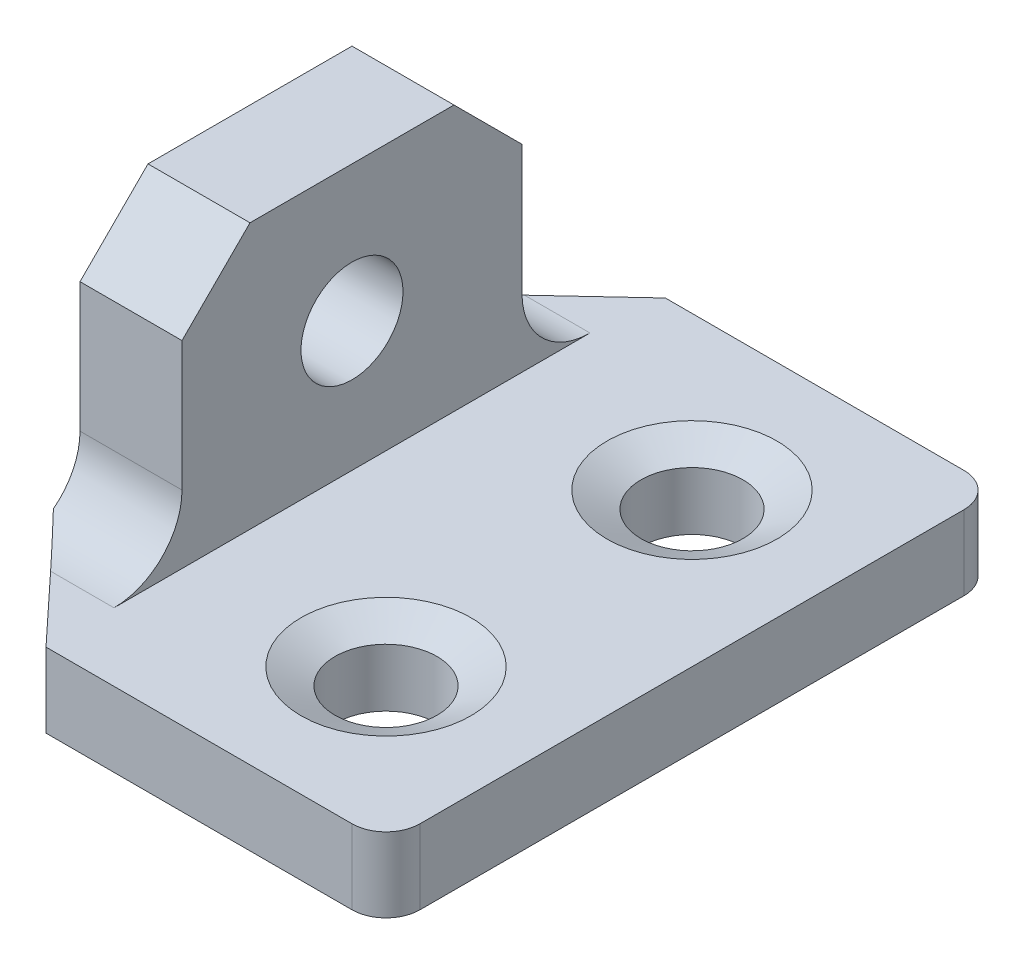
ISO-10303-21;
HEADER;
FILE_DESCRIPTION(('STEP AP214'),'2;1');
FILE_NAME('part.step','',(''),(''),'','','');
FILE_SCHEMA(('AUTOMOTIVE_DESIGN { 1 0 10303 214 1 1 1 1 }'));
ENDSEC;
DATA;
#1=APPLICATION_CONTEXT('core data for automotive mechanical design processes');
#2=APPLICATION_PROTOCOL_DEFINITION('international standard','automotive_design',2000,#1);
#3=PRODUCT_CONTEXT('',#1,'mechanical');
#4=PRODUCT('Part','Part','',(#3));
#5=PRODUCT_RELATED_PRODUCT_CATEGORY('part','',(#4));
#6=PRODUCT_DEFINITION_FORMATION('','',#4);
#7=PRODUCT_DEFINITION_CONTEXT('part definition',#1,'design');
#8=PRODUCT_DEFINITION('design','',#6,#7);
#9=PRODUCT_DEFINITION_SHAPE('','',#8);
#10=(LENGTH_UNIT() NAMED_UNIT(*) SI_UNIT(.MILLI.,.METRE.));
#11=(NAMED_UNIT(*) PLANE_ANGLE_UNIT() SI_UNIT($,.RADIAN.));
#12=(NAMED_UNIT(*) SI_UNIT($,.STERADIAN.) SOLID_ANGLE_UNIT());
#13=UNCERTAINTY_MEASURE_WITH_UNIT(LENGTH_MEASURE(1.E-05),#10,'distance_accuracy_value','');
#14=(GEOMETRIC_REPRESENTATION_CONTEXT(3) GLOBAL_UNCERTAINTY_ASSIGNED_CONTEXT((#13)) GLOBAL_UNIT_ASSIGNED_CONTEXT((#10,
#11,#12)) REPRESENTATION_CONTEXT('',''));
#15=CARTESIAN_POINT('',(0.,0.,0.));
#16=DIRECTION('',(0.,0.,1.));
#17=DIRECTION('',(1.,0.,0.));
#18=AXIS2_PLACEMENT_3D('',#15,#16,#17);
#19=CARTESIAN_POINT('',(28.,15.,20.));
#20=DIRECTION('',(0.,0.,1.));
#21=DIRECTION('',(1.,0.,0.));
#22=AXIS2_PLACEMENT_3D('',#19,#20,#21);
#23=PLANE('',#22);
#24=DIRECTION('',(0.,-1.,0.));
#25=VECTOR('',#24,1.);
#26=CARTESIAN_POINT('',(28.,15.,20.));
#27=LINE('',#26,#25);
#28=CARTESIAN_POINT('',(28.,13.,20.));
#29=VERTEX_POINT('',#28);
#30=CARTESIAN_POINT('',(28.,9.19234606418695,20.));
#31=VERTEX_POINT('',#30);
#32=EDGE_CURVE('E195',#29,#31,#27,.T.);
#33=ORIENTED_EDGE('',*,*,#32,.T.);
#34=DIRECTION('',(-1.,0.,0.));
#35=VECTOR('',#34,1.);
#36=CARTESIAN_POINT('',(28.,9.19234606418695,20.));
#37=LINE('',#36,#35);
#38=CARTESIAN_POINT('',(25.,9.19234606418695,20.));
#39=VERTEX_POINT('',#38);
#40=EDGE_CURVE('E248',#31,#39,#37,.T.);
#41=ORIENTED_EDGE('',*,*,#40,.T.);
#42=DIRECTION('',(0.,-1.,0.));
#43=VECTOR('',#42,1.);
#44=CARTESIAN_POINT('',(25.,15.,20.));
#45=LINE('',#44,#43);
#46=CARTESIAN_POINT('',(25.,13.,20.));
#47=VERTEX_POINT('',#46);
#48=EDGE_CURVE('E198',#47,#39,#45,.T.);
#49=ORIENTED_EDGE('',*,*,#48,.F.);
#50=DIRECTION('',(1.,0.,0.));
#51=VECTOR('',#50,1.);
#52=CARTESIAN_POINT('',(28.,13.,20.));
#53=LINE('',#52,#51);
#54=EDGE_CURVE('E193',#47,#29,#53,.T.);
#55=ORIENTED_EDGE('',*,*,#54,.T.);
#56=EDGE_LOOP('',(#33,#41,#49,#55));
#57=FACE_BOUND('',#56,.T.);
#58=ADVANCED_FACE('F43',(#57),#23,.F.);
#59=CARTESIAN_POINT('',(25.,15.,20.));
#60=DIRECTION('',(1.,0.,0.));
#61=DIRECTION('',(0.,0.,-1.));
#62=AXIS2_PLACEMENT_3D('',#59,#60,#61);
#63=PLANE('',#62);
#64=CARTESIAN_POINT('',(25.,11.,25.));
#65=DIRECTION('',(1.,0.,0.));
#66=DIRECTION('',(0.,0.,-1.));
#67=AXIS2_PLACEMENT_3D('',#64,#65,#66);
#68=CIRCLE('',#67,1.5);
#69=CARTESIAN_POINT('',(25.,11.,23.5));
#70=VERTEX_POINT('',#69);
#71=EDGE_CURVE('E199',#70,#70,#68,.T.);
#72=ORIENTED_EDGE('',*,*,#71,.T.);
#73=EDGE_LOOP('',(#72));
#74=FACE_BOUND('',#73,.T.);
#75=DIRECTION('',(0.,0.,1.));
#76=VECTOR('',#75,1.);
#77=CARTESIAN_POINT('',(25.,5.,20.));
#78=LINE('',#77,#76);
#79=CARTESIAN_POINT('',(25.,5.,19.));
#80=VERTEX_POINT('',#79);
#81=CARTESIAN_POINT('',(25.,5.,30.782893869926));
#82=VERTEX_POINT('',#81);
#83=EDGE_CURVE('E186',#80,#82,#78,.T.);
#84=ORIENTED_EDGE('',*,*,#83,.T.);
#85=DIRECTION('',(0.,1.,0.));
#86=VECTOR('',#85,1.);
#87=CARTESIAN_POINT('',(25.,7.19234606418695,30.782893869926));
#88=LINE('',#87,#86);
#89=CARTESIAN_POINT('',(25.,7.60531970393395,30.782893869926));
#90=VERTEX_POINT('',#89);
#91=EDGE_CURVE('E232',#82,#90,#88,.T.);
#92=ORIENTED_EDGE('',*,*,#91,.T.);
#93=CARTESIAN_POINT('',(25.,9.19234606418695,32.));
#94=DIRECTION('',(1.,0.,0.));
#95=DIRECTION('',(0.,0.,-1.));
#96=AXIS2_PLACEMENT_3D('',#93,#94,#95);
#97=CIRCLE('',#96,2.);
#98=CARTESIAN_POINT('',(25.,9.19234606418695,30.));
#99=VERTEX_POINT('',#98);
#100=EDGE_CURVE('E256',#90,#99,#97,.T.);
#101=ORIENTED_EDGE('',*,*,#100,.T.);
#102=DIRECTION('',(0.,-1.,0.));
#103=VECTOR('',#102,1.);
#104=CARTESIAN_POINT('',(25.,15.,30.));
#105=LINE('',#104,#103);
#106=CARTESIAN_POINT('',(25.,13.,30.));
#107=VERTEX_POINT('',#106);
#108=EDGE_CURVE('E183',#107,#99,#105,.T.);
#109=ORIENTED_EDGE('',*,*,#108,.F.);
#110=DIRECTION('',(0.,0.707106781186548,-0.707106781186548));
#111=VECTOR('',#110,1.);
#112=CARTESIAN_POINT('',(25.,15.,28.));
#113=LINE('',#112,#111);
#114=CARTESIAN_POINT('',(25.,15.,28.));
#115=VERTEX_POINT('',#114);
#116=EDGE_CURVE('E182',#107,#115,#113,.T.);
#117=ORIENTED_EDGE('',*,*,#116,.T.);
#118=DIRECTION('',(0.,0.,1.));
#119=VECTOR('',#118,1.);
#120=CARTESIAN_POINT('',(25.,15.,20.));
#121=LINE('',#120,#119);
#122=CARTESIAN_POINT('',(25.,15.,22.));
#123=VERTEX_POINT('',#122);
#124=EDGE_CURVE('E204',#123,#115,#121,.T.);
#125=ORIENTED_EDGE('',*,*,#124,.F.);
#126=DIRECTION('',(0.,-0.70710678118655,-0.707106781186545));
#127=VECTOR('',#126,1.);
#128=CARTESIAN_POINT('',(25.,15.,22.));
#129=LINE('',#128,#127);
#130=EDGE_CURVE('E197',#123,#47,#129,.T.);
#131=ORIENTED_EDGE('',*,*,#130,.T.);
#132=ORIENTED_EDGE('',*,*,#48,.T.);
#133=CARTESIAN_POINT('',(25.,9.19234606418695,18.));
#134=DIRECTION('',(1.,0.,0.));
#135=DIRECTION('',(0.,0.,-1.));
#136=AXIS2_PLACEMENT_3D('',#133,#134,#135);
#137=CIRCLE('',#136,2.);
#138=CARTESIAN_POINT('',(25.,7.46029525661808,19.));
#139=VERTEX_POINT('',#138);
#140=EDGE_CURVE('E258',#39,#139,#137,.T.);
#141=ORIENTED_EDGE('',*,*,#140,.T.);
#142=DIRECTION('',(0.,-1.,0.));
#143=VECTOR('',#142,1.);
#144=CARTESIAN_POINT('',(25.,4.99999999999999,19.));
#145=LINE('',#144,#143);
#146=EDGE_CURVE('E230',#139,#80,#145,.T.);
#147=ORIENTED_EDGE('',*,*,#146,.T.);
#148=EDGE_LOOP('',(#84,#92,#101,#109,#117,#125,#131,#132,#141,#147));
#149=FACE_BOUND('',#148,.T.);
#150=ADVANCED_FACE('F342',(#74,#149),#63,.F.);
#151=CARTESIAN_POINT('',(25.,15.,30.));
#152=DIRECTION('',(0.,0.,-1.));
#153=DIRECTION('',(-1.,0.,0.));
#154=AXIS2_PLACEMENT_3D('',#151,#152,#153);
#155=PLANE('',#154);
#156=ORIENTED_EDGE('',*,*,#108,.T.);
#157=DIRECTION('',(1.,0.,0.));
#158=VECTOR('',#157,1.);
#159=CARTESIAN_POINT('',(25.,9.19234606418695,30.));
#160=LINE('',#159,#158);
#161=CARTESIAN_POINT('',(28.,9.19234606418695,30.));
#162=VERTEX_POINT('',#161);
#163=EDGE_CURVE('E178',#99,#162,#160,.T.);
#164=ORIENTED_EDGE('',*,*,#163,.T.);
#165=DIRECTION('',(0.,-1.,0.));
#166=VECTOR('',#165,1.);
#167=CARTESIAN_POINT('',(28.,15.,30.));
#168=LINE('',#167,#166);
#169=CARTESIAN_POINT('',(28.,13.,30.));
#170=VERTEX_POINT('',#169);
#171=EDGE_CURVE('E162',#170,#162,#168,.T.);
#172=ORIENTED_EDGE('',*,*,#171,.F.);
#173=DIRECTION('',(-1.,0.,0.));
#174=VECTOR('',#173,1.);
#175=CARTESIAN_POINT('',(25.,13.,30.));
#176=LINE('',#175,#174);
#177=EDGE_CURVE('E175',#170,#107,#176,.T.);
#178=ORIENTED_EDGE('',*,*,#177,.T.);
#179=EDGE_LOOP('',(#156,#164,#172,#178));
#180=FACE_BOUND('',#179,.T.);
#181=ADVANCED_FACE('F174',(#180),#155,.F.);
#182=CARTESIAN_POINT('',(28.,15.,30.));
#183=DIRECTION('',(-1.,0.,0.));
#184=DIRECTION('',(0.,0.,1.));
#185=AXIS2_PLACEMENT_3D('',#182,#183,#184);
#186=PLANE('',#185);
#187=CARTESIAN_POINT('',(28.,11.,25.));
#188=DIRECTION('',(1.,0.,0.));
#189=DIRECTION('',(0.,0.,-1.));
#190=AXIS2_PLACEMENT_3D('',#187,#188,#189);
#191=CIRCLE('',#190,1.5);
#192=CARTESIAN_POINT('',(28.,11.,23.5));
#193=VERTEX_POINT('',#192);
#194=EDGE_CURVE('E207',#193,#193,#191,.T.);
#195=ORIENTED_EDGE('',*,*,#194,.F.);
#196=EDGE_LOOP('',(#195));
#197=FACE_BOUND('',#196,.T.);
#198=ORIENTED_EDGE('',*,*,#171,.T.);
#199=CARTESIAN_POINT('',(28.,9.19234606418695,32.));
#200=DIRECTION('',(-1.,0.,0.));
#201=DIRECTION('',(0.,0.,1.));
#202=AXIS2_PLACEMENT_3D('',#199,#200,#201);
#203=CIRCLE('',#202,2.);
#204=CARTESIAN_POINT('',(28.,7.19234606418695,32.));
#205=VERTEX_POINT('',#204);
#206=EDGE_CURVE('E251',#162,#205,#203,.T.);
#207=ORIENTED_EDGE('',*,*,#206,.T.);
#208=DIRECTION('',(0.,0.,-1.));
#209=VECTOR('',#208,1.);
#210=CARTESIAN_POINT('',(28.,7.19234606418695,30.));
#211=LINE('',#210,#209);
#212=CARTESIAN_POINT('',(28.,7.19234606418695,18.));
#213=VERTEX_POINT('',#212);
#214=EDGE_CURVE('E221',#205,#213,#211,.T.);
#215=ORIENTED_EDGE('',*,*,#214,.T.);
#216=CARTESIAN_POINT('',(28.,9.19234606418695,18.));
#217=DIRECTION('',(-1.,0.,0.));
#218=DIRECTION('',(0.,0.,1.));
#219=AXIS2_PLACEMENT_3D('',#216,#217,#218);
#220=CIRCLE('',#219,2.);
#221=EDGE_CURVE('E263',#213,#31,#220,.T.);
#222=ORIENTED_EDGE('',*,*,#221,.T.);
#223=ORIENTED_EDGE('',*,*,#32,.F.);
#224=DIRECTION('',(0.,0.70710678118655,0.707106781186545));
#225=VECTOR('',#224,1.);
#226=CARTESIAN_POINT('',(28.,15.,22.));
#227=LINE('',#226,#225);
#228=CARTESIAN_POINT('',(28.,15.,22.));
#229=VERTEX_POINT('',#228);
#230=EDGE_CURVE('E169',#29,#229,#227,.T.);
#231=ORIENTED_EDGE('',*,*,#230,.T.);
#232=DIRECTION('',(0.,0.,-1.));
#233=VECTOR('',#232,1.);
#234=CARTESIAN_POINT('',(28.,15.,30.));
#235=LINE('',#234,#233);
#236=CARTESIAN_POINT('',(28.,15.,28.));
#237=VERTEX_POINT('',#236);
#238=EDGE_CURVE('E164',#237,#229,#235,.T.);
#239=ORIENTED_EDGE('',*,*,#238,.F.);
#240=DIRECTION('',(0.,-0.707106781186548,0.707106781186548));
#241=VECTOR('',#240,1.);
#242=CARTESIAN_POINT('',(28.,15.,28.));
#243=LINE('',#242,#241);
#244=EDGE_CURVE('E158',#237,#170,#243,.T.);
#245=ORIENTED_EDGE('',*,*,#244,.T.);
#246=EDGE_LOOP('',(#198,#207,#215,#222,#223,#231,#239,#245));
#247=FACE_BOUND('',#246,.T.);
#248=ADVANCED_FACE('F160',(#197,#247),#186,.F.);
#249=CARTESIAN_POINT('',(0.,15.,0.));
#250=DIRECTION('',(0.,1.,0.));
#251=DIRECTION('',(0.,0.,1.));
#252=AXIS2_PLACEMENT_3D('',#249,#250,#251);
#253=PLANE('',#252);
#254=ORIENTED_EDGE('',*,*,#238,.T.);
#255=DIRECTION('',(-1.,0.,0.));
#256=VECTOR('',#255,1.);
#257=CARTESIAN_POINT('',(25.,15.,22.));
#258=LINE('',#257,#256);
#259=EDGE_CURVE('E201',#229,#123,#258,.T.);
#260=ORIENTED_EDGE('',*,*,#259,.T.);
#261=ORIENTED_EDGE('',*,*,#124,.T.);
#262=DIRECTION('',(1.,0.,0.));
#263=VECTOR('',#262,1.);
#264=CARTESIAN_POINT('',(28.,15.,28.));
#265=LINE('',#264,#263);
#266=EDGE_CURVE('E205',#115,#237,#265,.T.);
#267=ORIENTED_EDGE('',*,*,#266,.T.);
#268=EDGE_LOOP('',(#254,#260,#261,#267));
#269=FACE_BOUND('',#268,.T.);
#270=ADVANCED_FACE('F359',(#269),#253,.T.);
#271=CARTESIAN_POINT('',(0.,15.,22.));
#272=DIRECTION('',(0.,0.707106781186545,-0.70710678118655));
#273=DIRECTION('',(1.,0.,0.));
#274=AXIS2_PLACEMENT_3D('',#271,#272,#273);
#275=PLANE('',#274);
#276=ORIENTED_EDGE('',*,*,#230,.F.);
#277=ORIENTED_EDGE('',*,*,#54,.F.);
#278=ORIENTED_EDGE('',*,*,#130,.F.);
#279=ORIENTED_EDGE('',*,*,#259,.F.);
#280=EDGE_LOOP('',(#276,#277,#278,#279));
#281=FACE_BOUND('',#280,.T.);
#282=ADVANCED_FACE('F352',(#281),#275,.T.);
#283=CARTESIAN_POINT('',(0.,15.,28.));
#284=DIRECTION('',(0.,0.707106781186547,0.707106781186547));
#285=DIRECTION('',(-1.,0.,0.));
#286=AXIS2_PLACEMENT_3D('',#283,#284,#285);
#287=PLANE('',#286);
#288=ORIENTED_EDGE('',*,*,#116,.F.);
#289=ORIENTED_EDGE('',*,*,#177,.F.);
#290=ORIENTED_EDGE('',*,*,#244,.F.);
#291=ORIENTED_EDGE('',*,*,#266,.F.);
#292=EDGE_LOOP('',(#288,#289,#290,#291));
#293=FACE_BOUND('',#292,.T.);
#294=ADVANCED_FACE('F181',(#293),#287,.T.);
#295=CARTESIAN_POINT('',(-35.0000000000001,11.,25.0000000000001));
#296=DIRECTION('',(1.,0.,0.));
#297=DIRECTION('',(0.,0.,-1.));
#298=AXIS2_PLACEMENT_3D('',#295,#296,#297);
#299=CYLINDRICAL_SURFACE('',#298,1.5);
#300=ORIENTED_EDGE('',*,*,#194,.T.);
#301=EDGE_LOOP('',(#300));
#302=FACE_BOUND('',#301,.T.);
#303=ORIENTED_EDGE('',*,*,#71,.F.);
#304=EDGE_LOOP('',(#303));
#305=FACE_BOUND('',#304,.T.);
#306=ADVANCED_FACE('F364',(#302,#305),#299,.F.);
#307=CARTESIAN_POINT('',(-71.,5.,75.));
#308=DIRECTION('',(0.,1.,0.));
#309=DIRECTION('',(0.,0.,1.));
#310=AXIS2_PLACEMENT_3D('',#307,#308,#309);
#311=PLANE('',#310);
#312=CARTESIAN_POINT('',(33.5,5.,20.5));
#313=DIRECTION('',(0.,1.,0.));
#314=DIRECTION('',(0.,0.,1.));
#315=AXIS2_PLACEMENT_3D('',#312,#313,#314);
#316=CIRCLE('',#315,1.5);
#317=CARTESIAN_POINT('',(33.5,5.,22.));
#318=VERTEX_POINT('',#317);
#319=EDGE_CURVE('E316',#318,#318,#316,.T.);
#320=ORIENTED_EDGE('',*,*,#319,.T.);
#321=EDGE_LOOP('',(#320));
#322=FACE_BOUND('',#321,.T.);
#323=CARTESIAN_POINT('',(33.5,5.,29.5));
#324=DIRECTION('',(0.,1.,0.));
#325=DIRECTION('',(0.,0.,1.));
#326=AXIS2_PLACEMENT_3D('',#323,#324,#325);
#327=CIRCLE('',#326,1.5);
#328=CARTESIAN_POINT('',(33.5,5.,31.));
#329=VERTEX_POINT('',#328);
#330=EDGE_CURVE('E319',#329,#329,#327,.T.);
#331=ORIENTED_EDGE('',*,*,#330,.T.);
#332=EDGE_LOOP('',(#331));
#333=FACE_BOUND('',#332,.T.);
#334=DIRECTION('',(0.,0.,-1.));
#335=VECTOR('',#334,1.);
#336=CARTESIAN_POINT('',(38.,5.,34.));
#337=LINE('',#336,#335);
#338=CARTESIAN_POINT('',(38.,5.,33.));
#339=VERTEX_POINT('',#338);
#340=CARTESIAN_POINT('',(38.,5.,17.));
#341=VERTEX_POINT('',#340);
#342=EDGE_CURVE('E299',#339,#341,#337,.T.);
#343=ORIENTED_EDGE('',*,*,#342,.F.);
#344=CARTESIAN_POINT('',(37.,5.,33.));
#345=DIRECTION('',(0.,1.,0.));
#346=DIRECTION('',(0.,0.,1.));
#347=AXIS2_PLACEMENT_3D('',#344,#345,#346);
#348=CIRCLE('',#347,1.);
#349=CARTESIAN_POINT('',(37.,5.,34.));
#350=VERTEX_POINT('',#349);
#351=EDGE_CURVE('E285',#339,#350,#348,.F.);
#352=ORIENTED_EDGE('',*,*,#351,.T.);
#353=DIRECTION('',(1.,0.,0.));
#354=VECTOR('',#353,1.);
#355=CARTESIAN_POINT('',(25.,5.,34.));
#356=LINE('',#355,#354);
#357=CARTESIAN_POINT('',(28.,5.,34.));
#358=VERTEX_POINT('',#357);
#359=EDGE_CURVE('E190',#358,#350,#356,.T.);
#360=ORIENTED_EDGE('',*,*,#359,.F.);
#361=DIRECTION('',(-0.6819983600625,0.,-0.731353701619169));
#362=VECTOR('',#361,1.);
#363=CARTESIAN_POINT('',(28.,5.,34.));
#364=LINE('',#363,#362);
#365=EDGE_CURVE('E228',#358,#82,#364,.T.);
#366=ORIENTED_EDGE('',*,*,#365,.T.);
#367=ORIENTED_EDGE('',*,*,#83,.F.);
#368=DIRECTION('',(0.731353701619169,0.,-0.6819983600625));
#369=VECTOR('',#368,1.);
#370=CARTESIAN_POINT('',(28.217106130074,5.,16.));
#371=LINE('',#370,#369);
#372=CARTESIAN_POINT('',(28.217106130074,5.,16.));
#373=VERTEX_POINT('',#372);
#374=EDGE_CURVE('E226',#80,#373,#371,.T.);
#375=ORIENTED_EDGE('',*,*,#374,.T.);
#376=DIRECTION('',(1.,0.,0.));
#377=VECTOR('',#376,1.);
#378=CARTESIAN_POINT('',(25.,5.,16.));
#379=LINE('',#378,#377);
#380=CARTESIAN_POINT('',(37.,5.,16.));
#381=VERTEX_POINT('',#380);
#382=EDGE_CURVE('E307',#373,#381,#379,.T.);
#383=ORIENTED_EDGE('',*,*,#382,.T.);
#384=CARTESIAN_POINT('',(37.,5.,17.));
#385=DIRECTION('',(0.,1.,0.));
#386=DIRECTION('',(0.,0.,1.));
#387=AXIS2_PLACEMENT_3D('',#384,#385,#386);
#388=CIRCLE('',#387,1.);
#389=EDGE_CURVE('E283',#381,#341,#388,.F.);
#390=ORIENTED_EDGE('',*,*,#389,.T.);
#391=EDGE_LOOP('',(#343,#352,#360,#366,#367,#375,#383,#390));
#392=FACE_BOUND('',#391,.T.);
#393=ADVANCED_FACE('F304',(#322,#333,#392),#311,.F.);
#394=CARTESIAN_POINT('',(25.,7.19234606418695,34.));
#395=DIRECTION('',(0.,1.,0.));
#396=DIRECTION('',(0.,0.,1.));
#397=AXIS2_PLACEMENT_3D('',#394,#395,#396);
#398=PLANE('',#397);
#399=CARTESIAN_POINT('',(33.5,7.19234606418695,20.5));
#400=DIRECTION('',(0.,1.,0.));
#401=DIRECTION('',(0.,0.,1.));
#402=AXIS2_PLACEMENT_3D('',#399,#400,#401);
#403=CIRCLE('',#402,2.50000000000002);
#404=CARTESIAN_POINT('',(33.5,7.19234606418695,23.));
#405=VERTEX_POINT('',#404);
#406=EDGE_CURVE('E271',#405,#405,#403,.F.);
#407=ORIENTED_EDGE('',*,*,#406,.T.);
#408=EDGE_LOOP('',(#407));
#409=FACE_BOUND('',#408,.T.);
#410=CARTESIAN_POINT('',(33.5,7.19234606418695,29.5));
#411=DIRECTION('',(0.,1.,0.));
#412=DIRECTION('',(0.,0.,1.));
#413=AXIS2_PLACEMENT_3D('',#410,#411,#412);
#414=CIRCLE('',#413,2.50000000000001);
#415=CARTESIAN_POINT('',(33.5,7.19234606418695,32.));
#416=VERTEX_POINT('',#415);
#417=EDGE_CURVE('E268',#416,#416,#414,.F.);
#418=ORIENTED_EDGE('',*,*,#417,.T.);
#419=EDGE_LOOP('',(#418));
#420=FACE_BOUND('',#419,.T.);
#421=DIRECTION('',(1.,0.,0.));
#422=VECTOR('',#421,1.);
#423=CARTESIAN_POINT('',(25.,7.19234606418695,34.));
#424=LINE('',#423,#422);
#425=CARTESIAN_POINT('',(28.,7.19234606418695,34.));
#426=VERTEX_POINT('',#425);
#427=CARTESIAN_POINT('',(37.,7.19234606418695,34.));
#428=VERTEX_POINT('',#427);
#429=EDGE_CURVE('E196',#426,#428,#424,.T.);
#430=ORIENTED_EDGE('',*,*,#429,.T.);
#431=CARTESIAN_POINT('',(37.,7.19234606418695,33.));
#432=DIRECTION('',(0.,1.,0.));
#433=DIRECTION('',(0.,0.,1.));
#434=AXIS2_PLACEMENT_3D('',#431,#432,#433);
#435=CIRCLE('',#434,1.);
#436=CARTESIAN_POINT('',(38.,7.19234606418695,33.));
#437=VERTEX_POINT('',#436);
#438=EDGE_CURVE('E51',#428,#437,#435,.T.);
#439=ORIENTED_EDGE('',*,*,#438,.T.);
#440=DIRECTION('',(0.,0.,1.));
#441=VECTOR('',#440,1.);
#442=CARTESIAN_POINT('',(38.,7.19234606418695,34.));
#443=LINE('',#442,#441);
#444=CARTESIAN_POINT('',(38.,7.19234606418695,17.));
#445=VERTEX_POINT('',#444);
#446=EDGE_CURVE('E291',#445,#437,#443,.T.);
#447=ORIENTED_EDGE('',*,*,#446,.F.);
#448=CARTESIAN_POINT('',(37.,7.19234606418695,17.));
#449=DIRECTION('',(0.,1.,0.));
#450=DIRECTION('',(0.,0.,1.));
#451=AXIS2_PLACEMENT_3D('',#448,#449,#450);
#452=CIRCLE('',#451,1.);
#453=CARTESIAN_POINT('',(37.,7.19234606418695,16.));
#454=VERTEX_POINT('',#453);
#455=EDGE_CURVE('E58',#445,#454,#452,.T.);
#456=ORIENTED_EDGE('',*,*,#455,.T.);
#457=DIRECTION('',(1.,0.,0.));
#458=VECTOR('',#457,1.);
#459=CARTESIAN_POINT('',(25.,7.19234606418695,16.));
#460=LINE('',#459,#458);
#461=CARTESIAN_POINT('',(28.217106130074,7.19234606418695,16.));
#462=VERTEX_POINT('',#461);
#463=EDGE_CURVE('E309',#462,#454,#460,.T.);
#464=ORIENTED_EDGE('',*,*,#463,.F.);
#465=DIRECTION('',(-0.731353701619169,0.,0.6819983600625));
#466=VECTOR('',#465,1.);
#467=CARTESIAN_POINT('',(17.5182696230513,7.19234606418695,25.9768264469191));
#468=LINE('',#467,#466);
#469=CARTESIAN_POINT('',(26.0723687100247,7.19234606418695,18.));
#470=VERTEX_POINT('',#469);
#471=EDGE_CURVE('E234',#462,#470,#468,.T.);
#472=ORIENTED_EDGE('',*,*,#471,.T.);
#473=DIRECTION('',(-1.,0.,0.));
#474=VECTOR('',#473,1.);
#475=CARTESIAN_POINT('',(25.,7.19234606418695,18.));
#476=LINE('',#475,#474);
#477=EDGE_CURVE('E243',#470,#213,#476,.F.);
#478=ORIENTED_EDGE('',*,*,#477,.T.);
#479=ORIENTED_EDGE('',*,*,#214,.F.);
#480=DIRECTION('',(1.,0.,0.));
#481=VECTOR('',#480,1.);
#482=CARTESIAN_POINT('',(25.,7.19234606418695,32.));
#483=LINE('',#482,#481);
#484=CARTESIAN_POINT('',(26.1349698277247,7.19234606418695,32.));
#485=VERTEX_POINT('',#484);
#486=EDGE_CURVE('E246',#205,#485,#483,.F.);
#487=ORIENTED_EDGE('',*,*,#486,.T.);
#488=DIRECTION('',(0.6819983600625,0.,0.731353701619169));
#489=VECTOR('',#488,1.);
#490=CARTESIAN_POINT('',(26.6046347106162,7.19234606418695,32.5036539246103));
#491=LINE('',#490,#489);
#492=EDGE_CURVE('E237',#485,#426,#491,.T.);
#493=ORIENTED_EDGE('',*,*,#492,.T.);
#494=EDGE_LOOP('',(#430,#439,#447,#456,#464,#472,#478,#479,#487,#493));
#495=FACE_BOUND('',#494,.T.);
#496=ADVANCED_FACE('F290',(#409,#420,#495),#398,.T.);
#497=CARTESIAN_POINT('',(25.,7.19234606418695,34.));
#498=DIRECTION('',(0.,0.,1.));
#499=DIRECTION('',(1.,0.,0.));
#500=AXIS2_PLACEMENT_3D('',#497,#498,#499);
#501=PLANE('',#500);
#502=ORIENTED_EDGE('',*,*,#359,.T.);
#503=DIRECTION('',(0.,-1.,0.));
#504=VECTOR('',#503,1.);
#505=CARTESIAN_POINT('',(37.,7.19234606418695,34.));
#506=LINE('',#505,#504);
#507=EDGE_CURVE('E66',#350,#428,#506,.F.);
#508=ORIENTED_EDGE('',*,*,#507,.T.);
#509=ORIENTED_EDGE('',*,*,#429,.F.);
#510=DIRECTION('',(0.,-1.,0.));
#511=VECTOR('',#510,1.);
#512=CARTESIAN_POINT('',(28.,5.,34.));
#513=LINE('',#512,#511);
#514=EDGE_CURVE('E223',#426,#358,#513,.T.);
#515=ORIENTED_EDGE('',*,*,#514,.T.);
#516=EDGE_LOOP('',(#502,#508,#509,#515));
#517=FACE_BOUND('',#516,.T.);
#518=ADVANCED_FACE('F305',(#517),#501,.T.);
#519=CARTESIAN_POINT('',(25.,7.19234606418695,16.));
#520=DIRECTION('',(0.,0.,-1.));
#521=DIRECTION('',(0.,1.,0.));
#522=AXIS2_PLACEMENT_3D('',#519,#520,#521);
#523=PLANE('',#522);
#524=ORIENTED_EDGE('',*,*,#463,.T.);
#525=DIRECTION('',(0.,1.,0.));
#526=VECTOR('',#525,1.);
#527=CARTESIAN_POINT('',(37.,7.19234606418695,16.));
#528=LINE('',#527,#526);
#529=EDGE_CURVE('E11',#454,#381,#528,.F.);
#530=ORIENTED_EDGE('',*,*,#529,.T.);
#531=ORIENTED_EDGE('',*,*,#382,.F.);
#532=DIRECTION('',(0.,1.,0.));
#533=VECTOR('',#532,1.);
#534=CARTESIAN_POINT('',(28.217106130074,7.19234606418695,16.));
#535=LINE('',#534,#533);
#536=EDGE_CURVE('E239',#373,#462,#535,.T.);
#537=ORIENTED_EDGE('',*,*,#536,.T.);
#538=EDGE_LOOP('',(#524,#530,#531,#537));
#539=FACE_BOUND('',#538,.T.);
#540=ADVANCED_FACE('F409',(#539),#523,.T.);
#541=CARTESIAN_POINT('',(38.,0.,0.));
#542=DIRECTION('',(1.,0.,0.));
#543=DIRECTION('',(0.,0.,-1.));
#544=AXIS2_PLACEMENT_3D('',#541,#542,#543);
#545=PLANE('',#544);
#546=ORIENTED_EDGE('',*,*,#446,.T.);
#547=DIRECTION('',(0.,-1.,0.));
#548=VECTOR('',#547,1.);
#549=CARTESIAN_POINT('',(38.,0.,33.));
#550=LINE('',#549,#548);
#551=EDGE_CURVE('E280',#437,#339,#550,.T.);
#552=ORIENTED_EDGE('',*,*,#551,.T.);
#553=ORIENTED_EDGE('',*,*,#342,.T.);
#554=DIRECTION('',(0.,1.,0.));
#555=VECTOR('',#554,1.);
#556=CARTESIAN_POINT('',(38.,0.,17.));
#557=LINE('',#556,#555);
#558=EDGE_CURVE('E277',#341,#445,#557,.T.);
#559=ORIENTED_EDGE('',*,*,#558,.T.);
#560=EDGE_LOOP('',(#546,#552,#553,#559));
#561=FACE_BOUND('',#560,.T.);
#562=ADVANCED_FACE('F295',(#561),#545,.T.);
#563=CARTESIAN_POINT('',(28.,7.19234606418695,34.));
#564=DIRECTION('',(-0.731353701619169,0.,0.6819983600625));
#565=DIRECTION('',(0.,1.,0.));
#566=AXIS2_PLACEMENT_3D('',#563,#564,#565);
#567=PLANE('',#566);
#568=ORIENTED_EDGE('',*,*,#492,.F.);
#569=CARTESIAN_POINT('',(26.1349698277247,9.19234606418695,32.));
#570=DIRECTION('',(-0.731353701619169,0.,0.6819983600625));
#571=DIRECTION('',(0.6819983600625,0.,0.731353701619169));
#572=AXIS2_PLACEMENT_3D('',#569,#570,#571);
#573=ELLIPSE('',#572,2.7346549221972,2.);
#574=EDGE_CURVE('E253',#485,#90,#573,.F.);
#575=ORIENTED_EDGE('',*,*,#574,.T.);
#576=ORIENTED_EDGE('',*,*,#91,.F.);
#577=ORIENTED_EDGE('',*,*,#365,.F.);
#578=ORIENTED_EDGE('',*,*,#514,.F.);
#579=EDGE_LOOP('',(#568,#575,#576,#577,#578));
#580=FACE_BOUND('',#579,.T.);
#581=ADVANCED_FACE('F372',(#580),#567,.T.);
#582=CARTESIAN_POINT('',(28.217106130074,7.19234606418695,16.));
#583=DIRECTION('',(-0.6819983600625,0.,-0.731353701619169));
#584=DIRECTION('',(0.,-1.,0.));
#585=AXIS2_PLACEMENT_3D('',#582,#583,#584);
#586=PLANE('',#585);
#587=ORIENTED_EDGE('',*,*,#374,.F.);
#588=ORIENTED_EDGE('',*,*,#146,.F.);
#589=CARTESIAN_POINT('',(26.0723687100247,9.19234606418695,18.));
#590=DIRECTION('',(-0.6819983600625,0.,-0.731353701619169));
#591=DIRECTION('',(-0.731353701619169,0.,0.6819983600625));
#592=AXIS2_PLACEMENT_3D('',#589,#590,#591);
#593=ELLIPSE('',#592,2.93255837127924,2.);
#594=EDGE_CURVE('E261',#139,#470,#593,.F.);
#595=ORIENTED_EDGE('',*,*,#594,.T.);
#596=ORIENTED_EDGE('',*,*,#471,.F.);
#597=ORIENTED_EDGE('',*,*,#536,.F.);
#598=EDGE_LOOP('',(#587,#588,#595,#596,#597));
#599=FACE_BOUND('',#598,.T.);
#600=ADVANCED_FACE('F378',(#599),#586,.T.);
#601=CARTESIAN_POINT('',(25.,9.19234606418695,32.));
#602=DIRECTION('',(1.,0.,0.));
#603=DIRECTION('',(0.,0.,-1.));
#604=AXIS2_PLACEMENT_3D('',#601,#602,#603);
#605=CYLINDRICAL_SURFACE('',#604,2.);
#606=ORIENTED_EDGE('',*,*,#574,.F.);
#607=ORIENTED_EDGE('',*,*,#486,.F.);
#608=ORIENTED_EDGE('',*,*,#206,.F.);
#609=ORIENTED_EDGE('',*,*,#163,.F.);
#610=ORIENTED_EDGE('',*,*,#100,.F.);
#611=EDGE_LOOP('',(#606,#607,#608,#609,#610));
#612=FACE_BOUND('',#611,.T.);
#613=ADVANCED_FACE('F337',(#612),#605,.F.);
#614=CARTESIAN_POINT('',(28.,9.19234606418695,18.));
#615=DIRECTION('',(-1.,0.,0.));
#616=DIRECTION('',(0.,0.,1.));
#617=AXIS2_PLACEMENT_3D('',#614,#615,#616);
#618=CYLINDRICAL_SURFACE('',#617,2.);
#619=ORIENTED_EDGE('',*,*,#221,.F.);
#620=ORIENTED_EDGE('',*,*,#477,.F.);
#621=ORIENTED_EDGE('',*,*,#594,.F.);
#622=ORIENTED_EDGE('',*,*,#140,.F.);
#623=ORIENTED_EDGE('',*,*,#40,.F.);
#624=EDGE_LOOP('',(#619,#620,#621,#622,#623));
#625=FACE_BOUND('',#624,.T.);
#626=ADVANCED_FACE('F327',(#625),#618,.F.);
#627=CARTESIAN_POINT('',(33.5,-2.80765393581305,29.5));
#628=DIRECTION('',(0.,1.,0.));
#629=DIRECTION('',(0.,0.,1.));
#630=AXIS2_PLACEMENT_3D('',#627,#628,#629);
#631=CYLINDRICAL_SURFACE('',#630,1.5);
#632=CARTESIAN_POINT('',(33.5,6.70461347562108,29.5));
#633=DIRECTION('',(0.,1.,0.));
#634=DIRECTION('',(0.,0.,1.));
#635=AXIS2_PLACEMENT_3D('',#632,#633,#634);
#636=CIRCLE('',#635,1.5);
#637=CARTESIAN_POINT('',(33.5,6.70461347562108,31.));
#638=VERTEX_POINT('',#637);
#639=EDGE_CURVE('E274',#638,#638,#636,.T.);
#640=ORIENTED_EDGE('',*,*,#639,.T.);
#641=EDGE_LOOP('',(#640));
#642=FACE_BOUND('',#641,.T.);
#643=ORIENTED_EDGE('',*,*,#330,.F.);
#644=EDGE_LOOP('',(#643));
#645=FACE_BOUND('',#644,.T.);
#646=ADVANCED_FACE('F324',(#642,#645),#631,.F.);
#647=CARTESIAN_POINT('',(33.5,-2.80765393581305,20.5));
#648=DIRECTION('',(0.,1.,0.));
#649=DIRECTION('',(0.,0.,1.));
#650=AXIS2_PLACEMENT_3D('',#647,#648,#649);
#651=CYLINDRICAL_SURFACE('',#650,1.5);
#652=CARTESIAN_POINT('',(33.5,6.70461347562108,20.5));
#653=DIRECTION('',(0.,1.,0.));
#654=DIRECTION('',(0.,0.,1.));
#655=AXIS2_PLACEMENT_3D('',#652,#653,#654);
#656=CIRCLE('',#655,1.5);
#657=CARTESIAN_POINT('',(33.5,6.70461347562108,22.));
#658=VERTEX_POINT('',#657);
#659=EDGE_CURVE('E265',#658,#658,#656,.T.);
#660=ORIENTED_EDGE('',*,*,#659,.T.);
#661=EDGE_LOOP('',(#660));
#662=FACE_BOUND('',#661,.T.);
#663=ORIENTED_EDGE('',*,*,#319,.F.);
#664=EDGE_LOOP('',(#663));
#665=FACE_BOUND('',#664,.T.);
#666=ADVANCED_FACE('F326',(#662,#665),#651,.F.);
#667=CARTESIAN_POINT('',(33.5,6.70461347562108,20.5));
#668=DIRECTION('',(0.,1.,0.));
#669=DIRECTION('',(0.,0.,1.));
#670=AXIS2_PLACEMENT_3D('',#667,#668,#669);
#671=CONICAL_SURFACE('',#670,1.5,1.11701072127637);
#672=ORIENTED_EDGE('',*,*,#406,.F.);
#673=EDGE_LOOP('',(#672));
#674=FACE_BOUND('',#673,.T.);
#675=ORIENTED_EDGE('',*,*,#659,.F.);
#676=EDGE_LOOP('',(#675));
#677=FACE_BOUND('',#676,.T.);
#678=ADVANCED_FACE('F334',(#674,#677),#671,.F.);
#679=CARTESIAN_POINT('',(33.5,6.70461347562108,29.5));
#680=DIRECTION('',(0.,1.,0.));
#681=DIRECTION('',(0.,0.,1.));
#682=AXIS2_PLACEMENT_3D('',#679,#680,#681);
#683=CONICAL_SURFACE('',#682,1.5,1.11701072127637);
#684=ORIENTED_EDGE('',*,*,#417,.F.);
#685=EDGE_LOOP('',(#684));
#686=FACE_BOUND('',#685,.T.);
#687=ORIENTED_EDGE('',*,*,#639,.F.);
#688=EDGE_LOOP('',(#687));
#689=FACE_BOUND('',#688,.T.);
#690=ADVANCED_FACE('F394',(#686,#689),#683,.F.);
#691=CARTESIAN_POINT('',(37.,0.,33.));
#692=DIRECTION('',(0.,-1.,0.));
#693=DIRECTION('',(0.,0.,-1.));
#694=AXIS2_PLACEMENT_3D('',#691,#692,#693);
#695=CYLINDRICAL_SURFACE('',#694,1.);
#696=ORIENTED_EDGE('',*,*,#438,.F.);
#697=ORIENTED_EDGE('',*,*,#507,.F.);
#698=ORIENTED_EDGE('',*,*,#351,.F.);
#699=ORIENTED_EDGE('',*,*,#551,.F.);
#700=EDGE_LOOP('',(#696,#697,#698,#699));
#701=FACE_BOUND('',#700,.T.);
#702=ADVANCED_FACE('F301',(#701),#695,.T.);
#703=CARTESIAN_POINT('',(37.,0.,17.));
#704=DIRECTION('',(0.,1.,0.));
#705=DIRECTION('',(0.,0.,1.));
#706=AXIS2_PLACEMENT_3D('',#703,#704,#705);
#707=CYLINDRICAL_SURFACE('',#706,1.);
#708=ORIENTED_EDGE('',*,*,#389,.F.);
#709=ORIENTED_EDGE('',*,*,#529,.F.);
#710=ORIENTED_EDGE('',*,*,#455,.F.);
#711=ORIENTED_EDGE('',*,*,#558,.F.);
#712=EDGE_LOOP('',(#708,#709,#710,#711));
#713=FACE_BOUND('',#712,.T.);
#714=ADVANCED_FACE('F45',(#713),#707,.T.);
#715=CLOSED_SHELL('',(#58,#150,#181,#248,#270,#282,#294,#306,#393,#496,#518,#540,#562,#581,#600,
#613,#626,#646,#666,#678,#690,#702,#714));
#716=MANIFOLD_SOLID_BREP('B2',#715);
#717=ADVANCED_BREP_SHAPE_REPRESENTATION('',(#18,#716),#14);
#718=SHAPE_DEFINITION_REPRESENTATION(#9,#717);
ENDSEC;
END-ISO-10303-21;
